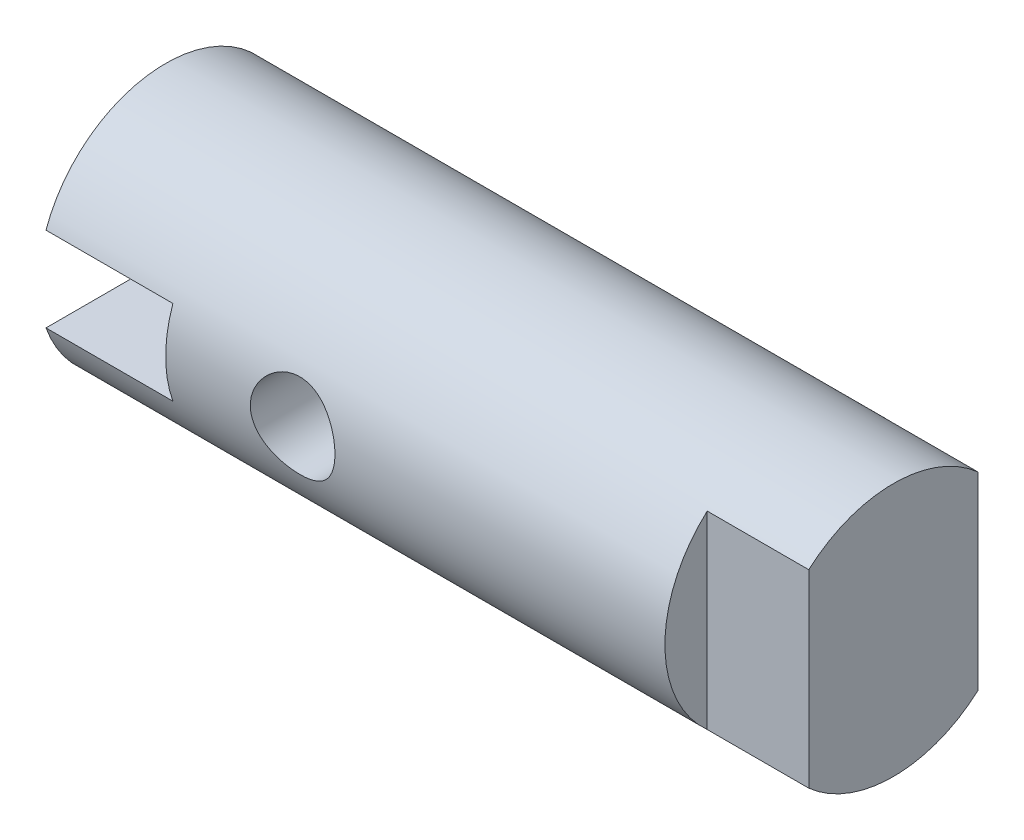
ISO-10303-21;
HEADER;
FILE_DESCRIPTION(('STEP AP214'),'2;1');
FILE_NAME('part.step','',(''),(''),'','','');
FILE_SCHEMA(('AUTOMOTIVE_DESIGN { 1 0 10303 214 1 1 1 1 }'));
ENDSEC;
DATA;
#1=APPLICATION_CONTEXT('core data for automotive mechanical design processes');
#2=APPLICATION_PROTOCOL_DEFINITION('international standard','automotive_design',2000,#1);
#3=PRODUCT_CONTEXT('',#1,'mechanical');
#4=PRODUCT('Part','Part','',(#3));
#5=PRODUCT_RELATED_PRODUCT_CATEGORY('part','',(#4));
#6=PRODUCT_DEFINITION_FORMATION('','',#4);
#7=PRODUCT_DEFINITION_CONTEXT('part definition',#1,'design');
#8=PRODUCT_DEFINITION('design','',#6,#7);
#9=PRODUCT_DEFINITION_SHAPE('','',#8);
#10=(LENGTH_UNIT() NAMED_UNIT(*) SI_UNIT(.MILLI.,.METRE.));
#11=(NAMED_UNIT(*) PLANE_ANGLE_UNIT() SI_UNIT($,.RADIAN.));
#12=(NAMED_UNIT(*) SI_UNIT($,.STERADIAN.) SOLID_ANGLE_UNIT());
#13=UNCERTAINTY_MEASURE_WITH_UNIT(LENGTH_MEASURE(1.E-05),#10,'distance_accuracy_value','');
#14=(GEOMETRIC_REPRESENTATION_CONTEXT(3) GLOBAL_UNCERTAINTY_ASSIGNED_CONTEXT((#13)) GLOBAL_UNIT_ASSIGNED_CONTEXT((#10,
#11,#12)) REPRESENTATION_CONTEXT('',''));
#15=CARTESIAN_POINT('',(0.,0.,0.));
#16=DIRECTION('',(0.,0.,1.));
#17=DIRECTION('',(1.,0.,0.));
#18=AXIS2_PLACEMENT_3D('',#15,#16,#17);
#19=CARTESIAN_POINT('',(46.99,0.,0.));
#20=DIRECTION('',(1.,0.,0.));
#21=DIRECTION('',(0.,0.,-1.));
#22=AXIS2_PLACEMENT_3D('',#19,#20,#21);
#23=PLANE('',#22);
#24=DIRECTION('',(0.,1.,0.));
#25=VECTOR('',#24,1.);
#26=CARTESIAN_POINT('',(46.99,7.09951582856183,-6.35));
#27=LINE('',#26,#25);
#28=CARTESIAN_POINT('',(46.99,-7.09951582856185,-6.35));
#29=VERTEX_POINT('',#28);
#30=CARTESIAN_POINT('',(46.99,7.09951582856185,-6.35));
#31=VERTEX_POINT('',#30);
#32=EDGE_CURVE('E72',#29,#31,#27,.T.);
#33=ORIENTED_EDGE('',*,*,#32,.F.);
#34=CARTESIAN_POINT('',(46.99,0.,0.));
#35=DIRECTION('',(1.,0.,0.));
#36=DIRECTION('',(0.,0.,-1.));
#37=AXIS2_PLACEMENT_3D('',#34,#35,#36);
#38=CIRCLE('',#37,9.525);
#39=EDGE_CURVE('E253',#29,#31,#38,.T.);
#40=ORIENTED_EDGE('',*,*,#39,.T.);
#41=EDGE_LOOP('',(#33,#40));
#42=FACE_BOUND('',#41,.T.);
#43=ADVANCED_FACE('F55',(#42),#23,.T.);
#44=CARTESIAN_POINT('',(0.,0.,0.));
#45=DIRECTION('',(1.,0.,0.));
#46=DIRECTION('',(0.,0.,-1.));
#47=AXIS2_PLACEMENT_3D('',#44,#45,#46);
#48=PLANE('',#47);
#49=CARTESIAN_POINT('',(0.,0.,0.));
#50=DIRECTION('',(1.,0.,0.));
#51=DIRECTION('',(0.,0.,-1.));
#52=AXIS2_PLACEMENT_3D('',#49,#50,#51);
#53=CIRCLE('',#52,9.525);
#54=CARTESIAN_POINT('',(0.,3.17500000000003,-8.98025612106916));
#55=VERTEX_POINT('',#54);
#56=CARTESIAN_POINT('',(0.,3.17500000000001,8.98025612106915));
#57=VERTEX_POINT('',#56);
#58=EDGE_CURVE('E258',#55,#57,#53,.T.);
#59=ORIENTED_EDGE('',*,*,#58,.F.);
#60=DIRECTION('',(0.,0.,1.));
#61=VECTOR('',#60,1.);
#62=CARTESIAN_POINT('',(0.,3.17500000000001,0.));
#63=LINE('',#62,#61);
#64=EDGE_CURVE('E273',#55,#57,#63,.T.);
#65=ORIENTED_EDGE('',*,*,#64,.T.);
#66=EDGE_LOOP('',(#59,#65));
#67=FACE_BOUND('',#66,.T.);
#68=ADVANCED_FACE('F190',(#67),#48,.F.);
#69=CARTESIAN_POINT('',(46.99,0.,0.));
#70=DIRECTION('',(-1.,0.,0.));
#71=DIRECTION('',(0.,0.,1.));
#72=AXIS2_PLACEMENT_3D('',#69,#70,#71);
#73=CYLINDRICAL_SURFACE('',#72,9.525);
#74=CARTESIAN_POINT('',(22.225,0.,9.52499999999999));
#75=CARTESIAN_POINT('',(22.225000805598,-0.17323867716533,9.52500048580497));
#76=CARTESIAN_POINT('',(22.2107751550461,-0.346472492659878,9.52023018186453));
#77=CARTESIAN_POINT('',(22.1544225795053,-0.687837590771669,9.50167042395415));
#78=CARTESIAN_POINT('',(22.1122927579622,-0.85596834177723,9.48788003366834));
#79=CARTESIAN_POINT('',(22.0017364022557,-1.18215660666812,9.45277852602955));
#80=CARTESIAN_POINT('',(21.9333538266918,-1.34023044718814,9.43147998545458));
#81=CARTESIAN_POINT('',(21.7724317762382,-1.64266542435688,9.38353615152559));
#82=CARTESIAN_POINT('',(21.6798875361167,-1.78702384834387,9.35688980370195));
#83=CARTESIAN_POINT('',(21.4699030695735,-2.06292981819568,9.30002249856541));
#84=CARTESIAN_POINT('',(21.3517758312229,-2.19393674844711,9.26971591772516));
#85=CARTESIAN_POINT('',(21.0954392838067,-2.4346937993291,9.20941499436409));
#86=CARTESIAN_POINT('',(20.957225564102,-2.54443923892902,9.17942072197492));
#87=CARTESIAN_POINT('',(20.6597722592512,-2.74264419157343,9.12219830615343));
#88=CARTESIAN_POINT('',(20.5000423763505,-2.83040092485176,9.09507449700309));
#89=CARTESIAN_POINT('',(20.1670409000941,-2.97757492456175,9.04796594704058));
#90=CARTESIAN_POINT('',(19.9937734580083,-3.03700083920296,9.02797902810366));
#91=CARTESIAN_POINT('',(19.6447625217479,-3.12379824029158,8.99830887880272));
#92=CARTESIAN_POINT('',(19.4692993630472,-3.15218269826285,8.98830104068515));
#93=CARTESIAN_POINT('',(19.1158375805551,-3.17925806658695,8.97876209798686));
#94=CARTESIAN_POINT('',(18.9378397572483,-3.17795815259496,8.97922775597168));
#95=CARTESIAN_POINT('',(18.5930011983402,-3.14648819425833,8.99029872650972));
#96=CARTESIAN_POINT('',(18.4260223207321,-3.11764017430519,9.00043970379416));
#97=CARTESIAN_POINT('',(18.0994258927483,-3.03404956704689,9.02895888275449));
#98=CARTESIAN_POINT('',(17.9398092262436,-2.97930387942919,9.04733807064543));
#99=CARTESIAN_POINT('',(17.629464520047,-2.84460650934117,9.09059367841716));
#100=CARTESIAN_POINT('',(17.4789210191343,-2.76426310464555,9.11556996393147));
#101=CARTESIAN_POINT('',(17.1930348662119,-2.58092291251245,9.1691637347793));
#102=CARTESIAN_POINT('',(17.0576966219865,-2.4779195817557,9.19778227084722));
#103=CARTESIAN_POINT('',(16.7986341758396,-2.2458341312661,9.25726270107577));
#104=CARTESIAN_POINT('',(16.6758851949337,-2.11567125149228,9.28816371201624));
#105=CARTESIAN_POINT('',(16.4537032283437,-1.83622813465494,9.3474202937884));
#106=CARTESIAN_POINT('',(16.3542724788278,-1.68694606622307,9.37577562033365));
#107=CARTESIAN_POINT('',(16.1807642467537,-1.37143367142188,9.42711817702495));
#108=CARTESIAN_POINT('',(16.1069480649932,-1.20504990262186,9.45004936275523));
#109=CARTESIAN_POINT('',(15.9886549226906,-0.861279339682302,9.48755300683579));
#110=CARTESIAN_POINT('',(15.9441677705306,-0.683896391141966,9.50212836854242));
#111=CARTESIAN_POINT('',(15.887523260379,-0.331418658755527,9.52079715951824));
#112=CARTESIAN_POINT('',(15.8740481058765,-0.156557979570874,9.52531755822085));
#113=CARTESIAN_POINT('',(15.8760562386751,0.192960847123766,9.52464766056075));
#114=CARTESIAN_POINT('',(15.8915346379361,0.367619023839904,9.51945900331475));
#115=CARTESIAN_POINT('',(15.9499678070617,0.706500575516027,9.50023578476806));
#116=CARTESIAN_POINT('',(15.9921137042071,0.870879661700644,9.48646180908034));
#117=CARTESIAN_POINT('',(16.1016741861819,1.19016766849016,9.45171613685471));
#118=CARTESIAN_POINT('',(16.1690919933102,1.34507537851484,9.43074352248193));
#119=CARTESIAN_POINT('',(16.3292486210945,1.64556534104866,9.38304356837145));
#120=CARTESIAN_POINT('',(16.4226068336741,1.79079512051446,9.35617936849619));
#121=CARTESIAN_POINT('',(16.6312664262928,2.0639558356805,9.29974181184132));
#122=CARTESIAN_POINT('',(16.7465745079009,2.19188146775096,9.27016762910402));
#123=CARTESIAN_POINT('',(17.0020575344459,2.432851712285,9.20993992337911));
#124=CARTESIAN_POINT('',(17.1431242954928,2.54495607735533,9.17929841452582));
#125=CARTESIAN_POINT('',(17.4427247277996,2.74401763337737,9.12177415210699));
#126=CARTESIAN_POINT('',(17.6012585446632,2.830974614681,9.09489142987858));
#127=CARTESIAN_POINT('',(17.9313618235454,2.97687025407197,9.04819093937643));
#128=CARTESIAN_POINT('',(18.1029041013608,3.03586556962396,9.02835890517706));
#129=CARTESIAN_POINT('',(18.4543022138901,3.12386556696096,8.99829392572976));
#130=CARTESIAN_POINT('',(18.6341542651588,3.15288375947877,8.98805665630057));
#131=CARTESIAN_POINT('',(18.9871257799299,3.17905219686557,8.97883201925514));
#132=CARTESIAN_POINT('',(19.1601164304107,3.17776306695418,8.97929370817292));
#133=CARTESIAN_POINT('',(19.5032791128775,3.14719428169961,8.99005281690777));
#134=CARTESIAN_POINT('',(19.6734513120074,3.11791629228103,9.00034965132723));
#135=CARTESIAN_POINT('',(20.0029307300328,3.03330550668569,9.02920864668031));
#136=CARTESIAN_POINT('',(20.1623829193893,2.97847812359927,9.04761011221365));
#137=CARTESIAN_POINT('',(20.469947017029,2.8447344862872,9.09054566248636));
#138=CARTESIAN_POINT('',(20.6180563990219,2.76581288515834,9.11508110823773));
#139=CARTESIAN_POINT('',(20.9057356520053,2.58210269895239,9.16885482792697));
#140=CARTESIAN_POINT('',(21.0446508935274,2.47633567077754,9.19825159463784));
#141=CARTESIAN_POINT('',(21.3032651574948,2.2435911539557,9.25777156199326));
#142=CARTESIAN_POINT('',(21.4229587278097,2.11660766813348,9.28789496596782));
#143=CARTESIAN_POINT('',(21.6444335090181,1.83909194322322,9.34688346918603));
#144=CARTESIAN_POINT('',(21.7453348041094,1.68783480536166,9.37565377218989));
#145=CARTESIAN_POINT('',(21.9201696116008,1.36955960976605,9.42740021973042));
#146=CARTESIAN_POINT('',(21.9941100183025,1.20254559507022,9.45037784507676));
#147=CARTESIAN_POINT('',(22.1098161831515,0.865167329863115,9.48707510342619));
#148=CARTESIAN_POINT('',(22.1528718303862,0.695286130622611,9.50116249441508));
#149=CARTESIAN_POINT('',(22.2104593911499,0.350267320832547,9.52012342428903));
#150=CARTESIAN_POINT('',(22.2249991856015,0.175131176180783,9.52499950888797));
#151=CARTESIAN_POINT('',(22.225,0.,9.52499999999999));
#152=B_SPLINE_CURVE_WITH_KNOTS('',3,(#74,#75,#76,#77,#78,#79,#80,#81,#82,#83,#84,#85,#86,#87,
#88,#89,#90,#91,#92,#93,#94,#95,#96,#97,#98,#99,#100,#101,#102,#103,#104,#105,#106,#107,#108,
#109,#110,#111,#112,#113,#114,#115,#116,#117,#118,#119,#120,#121,#122,#123,#124,#125,#126,#127,
#128,#129,#130,#131,#132,#133,#134,#135,#136,#137,#138,#139,#140,#141,#142,#143,#144,#145,#146,
#147,#148,#149,#150,#151),.UNSPECIFIED.,.T.,.F.,(4,2,2,2,2,2,2,2,2,2,2,2,2,2,2,2,2,2,2,2,2,2,2,
2,2,2,2,2,2,2,2,2,2,2,2,2,2,2,4),(0.,0.519071561632582,1.03819701322437,1.55645698636311,
2.07481924951214,2.6093637259775,3.14402575687908,3.69406121814518,4.24392866899746,
4.77526114230341,5.30642937910265,5.81332424300315,6.32027980466156,6.83539943417539,
7.35066800622306,7.89283745951088,8.43505888444012,8.98265937939884,9.53006948685135,
10.0537512658116,10.5773446429626,11.0857715158083,11.5942632377703,12.1161301950386,
12.638156741095,13.1839024764639,13.7296527614611,14.2742924389999,14.8186865394104,
15.3351123975402,15.8515075194061,16.3580948898032,16.8647947620873,17.3936046174648,
17.92256420318,18.4721392315144,19.0215736265905,19.5464607283686,20.0712027467109),.UNSPECIFIED.);
#153=CARTESIAN_POINT('',(22.225,0.,9.52499999999999));
#154=VERTEX_POINT('',#153);
#155=EDGE_CURVE('E156',#154,#154,#152,.T.);
#156=ORIENTED_EDGE('',*,*,#155,.T.);
#157=EDGE_LOOP('',(#156));
#158=FACE_BOUND('',#157,.T.);
#159=CARTESIAN_POINT('',(22.225,0.,-9.52500000000001));
#160=CARTESIAN_POINT('',(22.225000805598,0.173238677165359,-9.52500048580498));
#161=CARTESIAN_POINT('',(22.2107751550461,0.346472492659908,-9.52023018186456));
#162=CARTESIAN_POINT('',(22.1544225795053,0.687837590771698,-9.50167042395418));
#163=CARTESIAN_POINT('',(22.1122927579622,0.855968341777257,-9.48788003366835));
#164=CARTESIAN_POINT('',(22.0017364022556,1.18215660666815,-9.45277852602956));
#165=CARTESIAN_POINT('',(21.9333538266918,1.34023044718817,-9.4314799854546));
#166=CARTESIAN_POINT('',(21.7724317762382,1.64266542435692,-9.38353615152561));
#167=CARTESIAN_POINT('',(21.6798875361167,1.7870238483439,-9.35688980370196));
#168=CARTESIAN_POINT('',(21.4699030695735,2.0629298181957,-9.30002249856542));
#169=CARTESIAN_POINT('',(21.3517758312229,2.19393674844714,-9.26971591772518));
#170=CARTESIAN_POINT('',(21.0954392838066,2.43469379932913,-9.20941499436411));
#171=CARTESIAN_POINT('',(20.957225564102,2.54443923892906,-9.17942072197494));
#172=CARTESIAN_POINT('',(20.6597722592512,2.74264419157347,-9.12219830615345));
#173=CARTESIAN_POINT('',(20.5000423763505,2.83040092485179,-9.09507449700311));
#174=CARTESIAN_POINT('',(20.1670409000941,2.97757492456177,-9.0479659470406));
#175=CARTESIAN_POINT('',(19.9937734580083,3.03700083920298,-9.02797902810368));
#176=CARTESIAN_POINT('',(19.644762521748,3.1237982402916,-8.99830887880273));
#177=CARTESIAN_POINT('',(19.4692993630472,3.15218269826288,-8.98830104068516));
#178=CARTESIAN_POINT('',(19.1158375805551,3.17925806658697,-8.97876209798688));
#179=CARTESIAN_POINT('',(18.9378397572483,3.17795815259499,-8.97922775597169));
#180=CARTESIAN_POINT('',(18.5930011983403,3.14648819425836,-8.99029872650973));
#181=CARTESIAN_POINT('',(18.4260223207321,3.11764017430522,-9.00043970379418));
#182=CARTESIAN_POINT('',(18.0994258927483,3.03404956704692,-9.0289588827545));
#183=CARTESIAN_POINT('',(17.9398092262437,2.97930387942921,-9.04733807064543));
#184=CARTESIAN_POINT('',(17.6294645200471,2.84460650934119,-9.09059367841716));
#185=CARTESIAN_POINT('',(17.4789210191343,2.76426310464558,-9.11556996393148));
#186=CARTESIAN_POINT('',(17.1930348662119,2.58092291251249,-9.16916373477932));
#187=CARTESIAN_POINT('',(17.0576966219865,2.47791958175574,-9.19778227084723));
#188=CARTESIAN_POINT('',(16.7986341758396,2.24583413126612,-9.25726270107578));
#189=CARTESIAN_POINT('',(16.6758851949337,2.11567125149231,-9.28816371201627));
#190=CARTESIAN_POINT('',(16.4537032283437,1.83622813465497,-9.34742029378843));
#191=CARTESIAN_POINT('',(16.3542724788277,1.6869460662231,-9.37577562033366));
#192=CARTESIAN_POINT('',(16.1807642467537,1.37143367142191,-9.42711817702497));
#193=CARTESIAN_POINT('',(16.1069480649932,1.20504990262188,-9.45004936275526));
#194=CARTESIAN_POINT('',(15.9886549226906,0.861279339682328,-9.48755300683581));
#195=CARTESIAN_POINT('',(15.9441677705306,0.683896391141993,-9.50212836854242));
#196=CARTESIAN_POINT('',(15.887523260379,0.331418658755555,-9.52079715951824));
#197=CARTESIAN_POINT('',(15.8740481058765,0.156557979570901,-9.52531755822087));
#198=CARTESIAN_POINT('',(15.8760562386751,-0.192960847123739,-9.52464766056079));
#199=CARTESIAN_POINT('',(15.8915346379361,-0.367619023839876,-9.51945900331478));
#200=CARTESIAN_POINT('',(15.9499678070617,-0.706500575515997,-9.50023578476809));
#201=CARTESIAN_POINT('',(15.9921137042071,-0.870879661700613,-9.48646180908038));
#202=CARTESIAN_POINT('',(16.1016741861819,-1.19016766849013,-9.45171613685473));
#203=CARTESIAN_POINT('',(16.1690919933102,-1.3450753785148,-9.43074352248195));
#204=CARTESIAN_POINT('',(16.3292486210945,-1.64556534104862,-9.38304356837146));
#205=CARTESIAN_POINT('',(16.4226068336741,-1.79079512051442,-9.35617936849623));
#206=CARTESIAN_POINT('',(16.6312664262928,-2.06395583568047,-9.29974181184135));
#207=CARTESIAN_POINT('',(16.7465745079009,-2.19188146775093,-9.27016762910403));
#208=CARTESIAN_POINT('',(17.0020575344459,-2.43285171228498,-9.20993992337913));
#209=CARTESIAN_POINT('',(17.1431242954928,-2.5449560773553,-9.17929841452585));
#210=CARTESIAN_POINT('',(17.4427247277996,-2.74401763337734,-9.12177415210702));
#211=CARTESIAN_POINT('',(17.6012585446632,-2.83097461468096,-9.09489142987859));
#212=CARTESIAN_POINT('',(17.9313618235454,-2.97687025407194,-9.04819093937644));
#213=CARTESIAN_POINT('',(18.1029041013608,-3.03586556962392,-9.0283589051771));
#214=CARTESIAN_POINT('',(18.4543022138901,-3.12386556696094,-8.99829392572979));
#215=CARTESIAN_POINT('',(18.6341542651588,-3.15288375947876,-8.98805665630056));
#216=CARTESIAN_POINT('',(18.9871257799299,-3.17905219686556,-8.97883201925514));
#217=CARTESIAN_POINT('',(19.1601164304107,-3.17776306695415,-8.97929370817295));
#218=CARTESIAN_POINT('',(19.5032791128775,-3.14719428169958,-8.99005281690781));
#219=CARTESIAN_POINT('',(19.6734513120074,-3.11791629228101,-9.00034965132725));
#220=CARTESIAN_POINT('',(20.0029307300328,-3.03330550668567,-9.02920864668032));
#221=CARTESIAN_POINT('',(20.1623829193893,-2.97847812359924,-9.04761011221368));
#222=CARTESIAN_POINT('',(20.469947017029,-2.84473448628718,-9.0905456624864));
#223=CARTESIAN_POINT('',(20.6180563990219,-2.76581288515832,-9.11508110823776));
#224=CARTESIAN_POINT('',(20.9057356520052,-2.58210269895238,-9.16885482792699));
#225=CARTESIAN_POINT('',(21.0446508935274,-2.47633567077753,-9.19825159463787));
#226=CARTESIAN_POINT('',(21.3032651574948,-2.24359115395567,-9.25777156199329));
#227=CARTESIAN_POINT('',(21.4229587278096,-2.11660766813344,-9.28789496596783));
#228=CARTESIAN_POINT('',(21.6444335090181,-1.83909194322317,-9.34688346918604));
#229=CARTESIAN_POINT('',(21.7453348041094,-1.68783480536163,-9.37565377218992));
#230=CARTESIAN_POINT('',(21.9201696116008,-1.36955960976602,-9.42740021973045));
#231=CARTESIAN_POINT('',(21.9941100183025,-1.2025455950702,-9.45037784507678));
#232=CARTESIAN_POINT('',(22.1098161831515,-0.865167329863097,-9.48707510342621));
#233=CARTESIAN_POINT('',(22.1528718303862,-0.695286130622591,-9.50116249441511));
#234=CARTESIAN_POINT('',(22.2104593911499,-0.350267320832522,-9.52012342428906));
#235=CARTESIAN_POINT('',(22.2249991856015,-0.175131176180757,-9.52499950888799));
#236=CARTESIAN_POINT('',(22.225,0.,-9.52500000000001));
#237=B_SPLINE_CURVE_WITH_KNOTS('',3,(#159,#160,#161,#162,#163,#164,#165,#166,#167,#168,#169,
#170,#171,#172,#173,#174,#175,#176,#177,#178,#179,#180,#181,#182,#183,#184,#185,#186,#187,#188,
#189,#190,#191,#192,#193,#194,#195,#196,#197,#198,#199,#200,#201,#202,#203,#204,#205,#206,#207,
#208,#209,#210,#211,#212,#213,#214,#215,#216,#217,#218,#219,#220,#221,#222,#223,#224,#225,#226,
#227,#228,#229,#230,#231,#232,#233,#234,#235,#236),.UNSPECIFIED.,.T.,.F.,(4,2,2,2,2,2,2,2,2,2,2,
2,2,2,2,2,2,2,2,2,2,2,2,2,2,2,2,2,2,2,2,2,2,2,2,2,2,2,4),(0.,0.519071561632584,1.03819701322438,
1.55645698636312,2.07481924951214,2.6093637259775,3.14402575687909,3.69406121814518,
4.24392866899744,4.77526114230341,5.30642937910264,5.81332424300312,6.32027980466153,
6.83539943417538,7.35066800622305,7.89283745951088,8.43505888444012,8.98265937939884,
9.53006948685135,10.0537512658116,10.5773446429626,11.0857715158083,11.5942632377703,
12.1161301950386,12.638156741095,13.1839024764639,13.7296527614611,14.2742924389999,
14.8186865394104,15.3351123975402,15.8515075194061,16.3580948898032,16.8647947620873,
17.3936046174648,17.92256420318,18.4721392315144,19.0215736265905,19.5464607283686,
20.0712027467109),.UNSPECIFIED.);
#238=CARTESIAN_POINT('',(22.225,0.,-9.52500000000001));
#239=VERTEX_POINT('',#238);
#240=EDGE_CURVE('E152',#239,#239,#237,.T.);
#241=ORIENTED_EDGE('',*,*,#240,.T.);
#242=EDGE_LOOP('',(#241));
#243=FACE_BOUND('',#242,.T.);
#244=CARTESIAN_POINT('',(46.99,7.09951582856182,6.35));
#245=VERTEX_POINT('',#244);
#246=CARTESIAN_POINT('',(46.99,-7.09951582856183,6.35));
#247=VERTEX_POINT('',#246);
#248=EDGE_CURVE('E151',#245,#247,#38,.T.);
#249=ORIENTED_EDGE('',*,*,#248,.F.);
#250=DIRECTION('',(-1.,0.,0.));
#251=VECTOR('',#250,1.);
#252=CARTESIAN_POINT('',(54.61,7.09951582856183,6.35));
#253=LINE('',#252,#251);
#254=CARTESIAN_POINT('',(54.61,7.09951582856183,6.35));
#255=VERTEX_POINT('',#254);
#256=EDGE_CURVE('E134',#255,#245,#253,.T.);
#257=ORIENTED_EDGE('',*,*,#256,.F.);
#258=CARTESIAN_POINT('',(54.61,0.,0.));
#259=DIRECTION('',(1.,0.,0.));
#260=DIRECTION('',(0.,0.,1.));
#261=AXIS2_PLACEMENT_3D('',#258,#259,#260);
#262=CIRCLE('',#261,9.525);
#263=CARTESIAN_POINT('',(54.61,7.09951582856183,-6.35));
#264=VERTEX_POINT('',#263);
#265=EDGE_CURVE('E140',#264,#255,#262,.T.);
#266=ORIENTED_EDGE('',*,*,#265,.F.);
#267=DIRECTION('',(-1.,0.,0.));
#268=VECTOR('',#267,1.);
#269=CARTESIAN_POINT('',(54.61,7.09951582856183,-6.35));
#270=LINE('',#269,#268);
#271=EDGE_CURVE('E544',#264,#31,#270,.T.);
#272=ORIENTED_EDGE('',*,*,#271,.T.);
#273=ORIENTED_EDGE('',*,*,#39,.F.);
#274=DIRECTION('',(-1.,0.,0.));
#275=VECTOR('',#274,1.);
#276=CARTESIAN_POINT('',(54.61,-7.09951582856183,-6.35));
#277=LINE('',#276,#275);
#278=CARTESIAN_POINT('',(54.61,-7.09951582856183,-6.35));
#279=VERTEX_POINT('',#278);
#280=EDGE_CURVE('E158',#279,#29,#277,.T.);
#281=ORIENTED_EDGE('',*,*,#280,.F.);
#282=CARTESIAN_POINT('',(54.61,0.,0.));
#283=DIRECTION('',(1.,0.,0.));
#284=DIRECTION('',(0.,0.,-1.));
#285=AXIS2_PLACEMENT_3D('',#282,#283,#284);
#286=CIRCLE('',#285,9.525);
#287=CARTESIAN_POINT('',(54.61,-7.09951582856183,6.35));
#288=VERTEX_POINT('',#287);
#289=EDGE_CURVE('E139',#288,#279,#286,.T.);
#290=ORIENTED_EDGE('',*,*,#289,.F.);
#291=DIRECTION('',(-1.,0.,0.));
#292=VECTOR('',#291,1.);
#293=CARTESIAN_POINT('',(54.61,-7.09951582856183,6.35));
#294=LINE('',#293,#292);
#295=EDGE_CURVE('E136',#288,#247,#294,.T.);
#296=ORIENTED_EDGE('',*,*,#295,.T.);
#297=EDGE_LOOP('',(#249,#257,#266,#272,#273,#281,#290,#296));
#298=FACE_BOUND('',#297,.T.);
#299=CARTESIAN_POINT('',(9.52500000000001,0.,0.));
#300=DIRECTION('',(1.,0.,0.));
#301=DIRECTION('',(0.,0.,-1.));
#302=AXIS2_PLACEMENT_3D('',#299,#300,#301);
#303=CIRCLE('',#302,9.525);
#304=CARTESIAN_POINT('',(9.52500000000001,-3.175,-8.98025612106916));
#305=VERTEX_POINT('',#304);
#306=CARTESIAN_POINT('',(9.52500000000001,3.17500000000001,-8.98025612106916));
#307=VERTEX_POINT('',#306);
#308=EDGE_CURVE('E13',#305,#307,#303,.T.);
#309=ORIENTED_EDGE('',*,*,#308,.T.);
#310=DIRECTION('',(-1.,0.,0.));
#311=VECTOR('',#310,1.);
#312=CARTESIAN_POINT('',(46.99,3.17500000000003,-8.98025612106916));
#313=LINE('',#312,#311);
#314=EDGE_CURVE('E259',#307,#55,#313,.T.);
#315=ORIENTED_EDGE('',*,*,#314,.T.);
#316=ORIENTED_EDGE('',*,*,#58,.T.);
#317=DIRECTION('',(-1.,0.,0.));
#318=VECTOR('',#317,1.);
#319=CARTESIAN_POINT('',(46.99,3.175,8.98025612106916));
#320=LINE('',#319,#318);
#321=CARTESIAN_POINT('',(9.525,3.17500000000001,8.98025612106916));
#322=VERTEX_POINT('',#321);
#323=EDGE_CURVE('E289',#57,#322,#320,.F.);
#324=ORIENTED_EDGE('',*,*,#323,.T.);
#325=CARTESIAN_POINT('',(9.52500000000001,-3.17499999999999,8.98025612106915));
#326=VERTEX_POINT('',#325);
#327=EDGE_CURVE('E60',#322,#326,#303,.T.);
#328=ORIENTED_EDGE('',*,*,#327,.T.);
#329=DIRECTION('',(-1.,0.,0.));
#330=VECTOR('',#329,1.);
#331=CARTESIAN_POINT('',(46.99,-3.17499999999998,8.98025612106916));
#332=LINE('',#331,#330);
#333=CARTESIAN_POINT('',(0.,-3.17499999999998,8.98025612106915));
#334=VERTEX_POINT('',#333);
#335=EDGE_CURVE('E287',#326,#334,#332,.T.);
#336=ORIENTED_EDGE('',*,*,#335,.T.);
#337=CARTESIAN_POINT('',(0.,-3.175,-8.98025612106916));
#338=VERTEX_POINT('',#337);
#339=EDGE_CURVE('E262',#334,#338,#53,.T.);
#340=ORIENTED_EDGE('',*,*,#339,.T.);
#341=DIRECTION('',(-1.,0.,0.));
#342=VECTOR('',#341,1.);
#343=CARTESIAN_POINT('',(46.99,-3.17499999999999,-8.98025612106916));
#344=LINE('',#343,#342);
#345=EDGE_CURVE('E233',#338,#305,#344,.F.);
#346=ORIENTED_EDGE('',*,*,#345,.T.);
#347=EDGE_LOOP('',(#309,#315,#316,#324,#328,#336,#340,#346));
#348=FACE_BOUND('',#347,.T.);
#349=ADVANCED_FACE('F57',(#158,#243,#298,#348),#73,.T.);
#350=DIRECTION('',(0.,-1.,0.));
#351=VECTOR('',#350,1.);
#352=CARTESIAN_POINT('',(46.99,7.09951582856183,6.35));
#353=LINE('',#352,#351);
#354=EDGE_CURVE('E79',#245,#247,#353,.T.);
#355=ORIENTED_EDGE('',*,*,#354,.F.);
#356=ORIENTED_EDGE('',*,*,#248,.T.);
#357=EDGE_LOOP('',(#355,#356));
#358=FACE_BOUND('',#357,.T.);
#359=ADVANCED_FACE('F192',(#358),#23,.T.);
#360=ORIENTED_EDGE('',*,*,#339,.F.);
#361=DIRECTION('',(0.,0.,-1.));
#362=VECTOR('',#361,1.);
#363=CARTESIAN_POINT('',(0.,-3.17499999999997,0.));
#364=LINE('',#363,#362);
#365=EDGE_CURVE('E266',#334,#338,#364,.T.);
#366=ORIENTED_EDGE('',*,*,#365,.T.);
#367=EDGE_LOOP('',(#360,#366));
#368=FACE_BOUND('',#367,.T.);
#369=ADVANCED_FACE('F198',(#368),#48,.F.);
#370=CARTESIAN_POINT('',(9.52500000000001,3.17500000000003,-9.52500000000001));
#371=DIRECTION('',(1.,0.,0.));
#372=DIRECTION('',(0.,0.,-1.));
#373=AXIS2_PLACEMENT_3D('',#370,#371,#372);
#374=PLANE('',#373);
#375=DIRECTION('',(0.,0.,1.));
#376=VECTOR('',#375,1.);
#377=CARTESIAN_POINT('',(9.52500000000001,3.17500000000003,-9.52500000000001));
#378=LINE('',#377,#376);
#379=EDGE_CURVE('E224',#307,#322,#378,.T.);
#380=ORIENTED_EDGE('',*,*,#379,.F.);
#381=ORIENTED_EDGE('',*,*,#308,.F.);
#382=DIRECTION('',(0.,0.,1.));
#383=VECTOR('',#382,1.);
#384=CARTESIAN_POINT('',(9.525,-3.17499999999999,-9.52500000000001));
#385=LINE('',#384,#383);
#386=EDGE_CURVE('E217',#305,#326,#385,.T.);
#387=ORIENTED_EDGE('',*,*,#386,.T.);
#388=ORIENTED_EDGE('',*,*,#327,.F.);
#389=EDGE_LOOP('',(#380,#381,#387,#388));
#390=FACE_BOUND('',#389,.T.);
#391=ADVANCED_FACE('F205',(#390),#374,.F.);
#392=CARTESIAN_POINT('',(0.,3.175,-9.52500000000002));
#393=DIRECTION('',(0.,1.,0.));
#394=DIRECTION('',(0.,0.,1.));
#395=AXIS2_PLACEMENT_3D('',#392,#393,#394);
#396=PLANE('',#395);
#397=ORIENTED_EDGE('',*,*,#379,.T.);
#398=ORIENTED_EDGE('',*,*,#323,.F.);
#399=ORIENTED_EDGE('',*,*,#64,.F.);
#400=ORIENTED_EDGE('',*,*,#314,.F.);
#401=EDGE_LOOP('',(#397,#398,#399,#400));
#402=FACE_BOUND('',#401,.T.);
#403=ADVANCED_FACE('F293',(#402),#396,.F.);
#404=CARTESIAN_POINT('',(0.,-3.17499999999998,-9.52500000000002));
#405=DIRECTION('',(0.,-1.,0.));
#406=DIRECTION('',(0.,0.,-1.));
#407=AXIS2_PLACEMENT_3D('',#404,#405,#406);
#408=PLANE('',#407);
#409=ORIENTED_EDGE('',*,*,#386,.F.);
#410=ORIENTED_EDGE('',*,*,#345,.F.);
#411=ORIENTED_EDGE('',*,*,#365,.F.);
#412=ORIENTED_EDGE('',*,*,#335,.F.);
#413=EDGE_LOOP('',(#409,#410,#411,#412));
#414=FACE_BOUND('',#413,.T.);
#415=ADVANCED_FACE('F177',(#414),#408,.F.);
#416=CARTESIAN_POINT('',(19.05,0.,-9.52500000000001));
#417=DIRECTION('',(0.,0.,1.));
#418=DIRECTION('',(1.,0.,0.));
#419=AXIS2_PLACEMENT_3D('',#416,#417,#418);
#420=CYLINDRICAL_SURFACE('',#419,3.175);
#421=ORIENTED_EDGE('',*,*,#240,.F.);
#422=EDGE_LOOP('',(#421));
#423=FACE_BOUND('',#422,.T.);
#424=ORIENTED_EDGE('',*,*,#155,.F.);
#425=EDGE_LOOP('',(#424));
#426=FACE_BOUND('',#425,.T.);
#427=ADVANCED_FACE('F173',(#423,#426),#420,.F.);
#428=CARTESIAN_POINT('',(54.61,7.09951582856183,6.35));
#429=DIRECTION('',(0.,0.,-1.));
#430=DIRECTION('',(-1.,0.,0.));
#431=AXIS2_PLACEMENT_3D('',#428,#429,#430);
#432=PLANE('',#431);
#433=ORIENTED_EDGE('',*,*,#354,.T.);
#434=ORIENTED_EDGE('',*,*,#295,.F.);
#435=DIRECTION('',(0.,-1.,0.));
#436=VECTOR('',#435,1.);
#437=CARTESIAN_POINT('',(54.61,7.09951582856183,6.35));
#438=LINE('',#437,#436);
#439=EDGE_CURVE('E130',#255,#288,#438,.T.);
#440=ORIENTED_EDGE('',*,*,#439,.F.);
#441=ORIENTED_EDGE('',*,*,#256,.T.);
#442=EDGE_LOOP('',(#433,#434,#440,#441));
#443=FACE_BOUND('',#442,.T.);
#444=ADVANCED_FACE('F132',(#443),#432,.F.);
#445=CARTESIAN_POINT('',(54.61,7.09951582856183,-6.35));
#446=DIRECTION('',(0.,0.,1.));
#447=DIRECTION('',(1.,0.,0.));
#448=AXIS2_PLACEMENT_3D('',#445,#446,#447);
#449=PLANE('',#448);
#450=ORIENTED_EDGE('',*,*,#32,.T.);
#451=ORIENTED_EDGE('',*,*,#271,.F.);
#452=DIRECTION('',(0.,1.,0.));
#453=VECTOR('',#452,1.);
#454=CARTESIAN_POINT('',(54.61,7.09951582856183,-6.35));
#455=LINE('',#454,#453);
#456=EDGE_CURVE('E145',#279,#264,#455,.T.);
#457=ORIENTED_EDGE('',*,*,#456,.F.);
#458=ORIENTED_EDGE('',*,*,#280,.T.);
#459=EDGE_LOOP('',(#450,#451,#457,#458));
#460=FACE_BOUND('',#459,.T.);
#461=ADVANCED_FACE('F182',(#460),#449,.F.);
#462=CARTESIAN_POINT('',(54.61,0.,0.));
#463=DIRECTION('',(-1.,0.,0.));
#464=DIRECTION('',(0.,0.,1.));
#465=AXIS2_PLACEMENT_3D('',#462,#463,#464);
#466=PLANE('',#465);
#467=ORIENTED_EDGE('',*,*,#265,.T.);
#468=ORIENTED_EDGE('',*,*,#439,.T.);
#469=ORIENTED_EDGE('',*,*,#289,.T.);
#470=ORIENTED_EDGE('',*,*,#456,.T.);
#471=EDGE_LOOP('',(#467,#468,#469,#470));
#472=FACE_BOUND('',#471,.T.);
#473=ADVANCED_FACE('F143',(#472),#466,.F.);
#474=CLOSED_SHELL('',(#43,#68,#349,#359,#369,#391,#403,#415,#427,#444,#461,#473));
#475=MANIFOLD_SOLID_BREP('B2',#474);
#476=ADVANCED_BREP_SHAPE_REPRESENTATION('',(#18,#475),#14);
#477=SHAPE_DEFINITION_REPRESENTATION(#9,#476);
ENDSEC;
END-ISO-10303-21;
